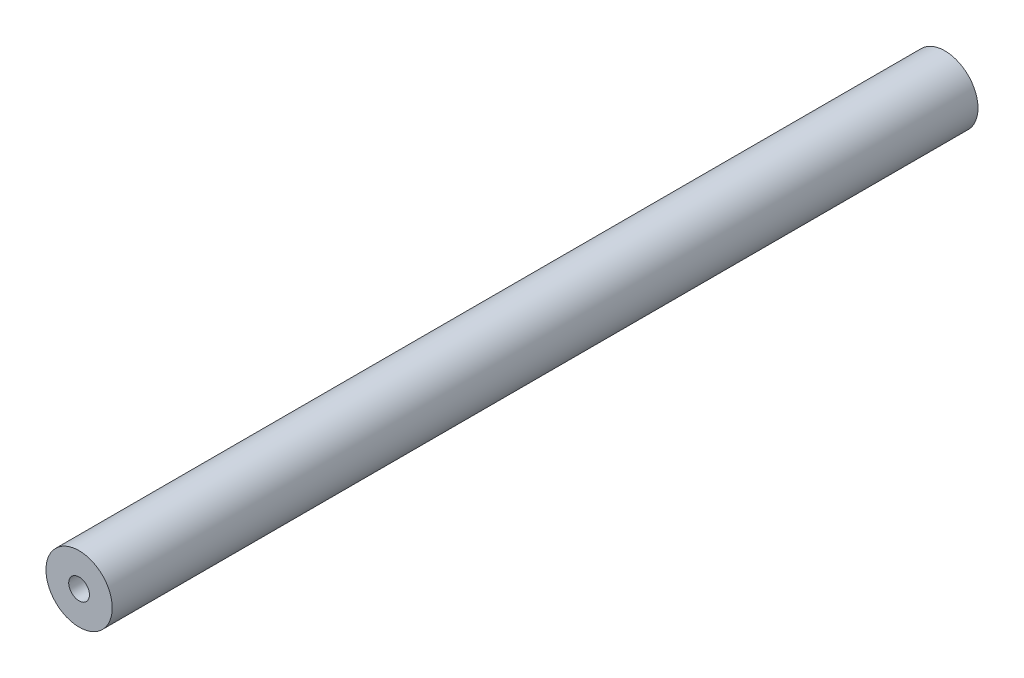
ISO-10303-21;
HEADER;
FILE_DESCRIPTION(('STEP AP214'),'2;1');
FILE_NAME('part.step','',(''),(''),'','','');
FILE_SCHEMA(('AUTOMOTIVE_DESIGN { 1 0 10303 214 1 1 1 1 }'));
ENDSEC;
DATA;
#1=APPLICATION_CONTEXT('core data for automotive mechanical design processes');
#2=APPLICATION_PROTOCOL_DEFINITION('international standard','automotive_design',2000,#1);
#3=PRODUCT_CONTEXT('',#1,'mechanical');
#4=PRODUCT('Part','Part','',(#3));
#5=PRODUCT_RELATED_PRODUCT_CATEGORY('part','',(#4));
#6=PRODUCT_DEFINITION_FORMATION('','',#4);
#7=PRODUCT_DEFINITION_CONTEXT('part definition',#1,'design');
#8=PRODUCT_DEFINITION('design','',#6,#7);
#9=PRODUCT_DEFINITION_SHAPE('','',#8);
#10=(LENGTH_UNIT() NAMED_UNIT(*) SI_UNIT(.MILLI.,.METRE.));
#11=(NAMED_UNIT(*) PLANE_ANGLE_UNIT() SI_UNIT($,.RADIAN.));
#12=(NAMED_UNIT(*) SI_UNIT($,.STERADIAN.) SOLID_ANGLE_UNIT());
#13=UNCERTAINTY_MEASURE_WITH_UNIT(LENGTH_MEASURE(1.E-05),#10,'distance_accuracy_value','');
#14=(GEOMETRIC_REPRESENTATION_CONTEXT(3) GLOBAL_UNCERTAINTY_ASSIGNED_CONTEXT((#13)) GLOBAL_UNIT_ASSIGNED_CONTEXT((#10,
#11,#12)) REPRESENTATION_CONTEXT('',''));
#15=CARTESIAN_POINT('',(0.,0.,0.));
#16=DIRECTION('',(0.,0.,1.));
#17=DIRECTION('',(1.,0.,0.));
#18=AXIS2_PLACEMENT_3D('',#15,#16,#17);
#19=CARTESIAN_POINT('',(0.,0.,9.99));
#20=DIRECTION('',(0.,0.,1.));
#21=DIRECTION('',(1.,0.,0.));
#22=AXIS2_PLACEMENT_3D('',#19,#20,#21);
#23=PLANE('',#22);
#24=CARTESIAN_POINT('',(0.,0.,9.99));
#25=DIRECTION('',(0.,0.,1.));
#26=DIRECTION('',(1.,0.,0.));
#27=AXIS2_PLACEMENT_3D('',#24,#25,#26);
#28=CIRCLE('',#27,1.25);
#29=CARTESIAN_POINT('',(1.25,0.,9.99));
#30=VERTEX_POINT('',#29);
#31=EDGE_CURVE('E9',#30,#30,#28,.T.);
#32=ORIENTED_EDGE('',*,*,#31,.F.);
#33=EDGE_LOOP('',(#32));
#34=FACE_BOUND('',#33,.T.);
#35=ADVANCED_FACE('F14',(#34),#23,.F.);
#36=CARTESIAN_POINT('',(0.,0.,94.51));
#37=DIRECTION('',(0.,0.,1.));
#38=DIRECTION('',(1.,0.,0.));
#39=AXIS2_PLACEMENT_3D('',#36,#37,#38);
#40=PLANE('',#39);
#41=CARTESIAN_POINT('',(0.,0.,94.51));
#42=DIRECTION('',(0.,0.,1.));
#43=DIRECTION('',(1.,0.,0.));
#44=AXIS2_PLACEMENT_3D('',#41,#42,#43);
#45=CIRCLE('',#44,1.25);
#46=CARTESIAN_POINT('',(1.25,0.,94.51));
#47=VERTEX_POINT('',#46);
#48=EDGE_CURVE('E112',#47,#47,#45,.T.);
#49=ORIENTED_EDGE('',*,*,#48,.T.);
#50=EDGE_LOOP('',(#49));
#51=FACE_BOUND('',#50,.T.);
#52=ADVANCED_FACE('F93',(#51),#40,.T.);
#53=CARTESIAN_POINT('',(0.,0.,-0.01));
#54=DIRECTION('',(0.,0.,1.));
#55=DIRECTION('',(1.,0.,0.));
#56=AXIS2_PLACEMENT_3D('',#53,#54,#55);
#57=CYLINDRICAL_SURFACE('',#56,1.25);
#58=CARTESIAN_POINT('',(0.,0.,0.));
#59=DIRECTION('',(0.,0.,1.));
#60=DIRECTION('',(1.,0.,0.));
#61=AXIS2_PLACEMENT_3D('',#58,#59,#60);
#62=CIRCLE('',#61,1.25);
#63=CARTESIAN_POINT('',(1.25,0.,0.));
#64=VERTEX_POINT('',#63);
#65=EDGE_CURVE('E18',#64,#64,#62,.T.);
#66=ORIENTED_EDGE('',*,*,#65,.F.);
#67=DIRECTION('',(0.,0.,1.));
#68=VECTOR('',#67,1.);
#69=CARTESIAN_POINT('',(1.25,0.,-0.01));
#70=LINE('',#69,#68);
#71=EDGE_CURVE('E25',#64,#30,#70,.T.);
#72=ORIENTED_EDGE('',*,*,#71,.T.);
#73=ORIENTED_EDGE('',*,*,#31,.T.);
#74=ORIENTED_EDGE('',*,*,#71,.F.);
#75=EDGE_LOOP('',(#66,#72,#73,#74));
#76=FACE_BOUND('',#75,.T.);
#77=ADVANCED_FACE('F99',(#76),#57,.F.);
#78=CARTESIAN_POINT('',(0.,0.,94.51));
#79=DIRECTION('',(0.,0.,1.));
#80=DIRECTION('',(1.,0.,0.));
#81=AXIS2_PLACEMENT_3D('',#78,#79,#80);
#82=CYLINDRICAL_SURFACE('',#81,1.25);
#83=DIRECTION('',(0.,0.,1.));
#84=VECTOR('',#83,1.);
#85=CARTESIAN_POINT('',(1.25,0.,94.51));
#86=LINE('',#85,#84);
#87=CARTESIAN_POINT('',(1.25,0.,104.5));
#88=VERTEX_POINT('',#87);
#89=EDGE_CURVE('E111',#47,#88,#86,.T.);
#90=ORIENTED_EDGE('',*,*,#89,.F.);
#91=ORIENTED_EDGE('',*,*,#48,.F.);
#92=ORIENTED_EDGE('',*,*,#89,.T.);
#93=CARTESIAN_POINT('',(0.,0.,104.5));
#94=DIRECTION('',(0.,0.,1.));
#95=DIRECTION('',(1.,0.,0.));
#96=AXIS2_PLACEMENT_3D('',#93,#94,#95);
#97=CIRCLE('',#96,1.25);
#98=EDGE_CURVE('E64',#88,#88,#97,.T.);
#99=ORIENTED_EDGE('',*,*,#98,.T.);
#100=EDGE_LOOP('',(#90,#91,#92,#99));
#101=FACE_BOUND('',#100,.T.);
#102=ADVANCED_FACE('F89',(#101),#82,.F.);
#103=CARTESIAN_POINT('',(0.,0.,0.));
#104=DIRECTION('',(0.,0.,1.));
#105=DIRECTION('',(1.,0.,0.));
#106=AXIS2_PLACEMENT_3D('',#103,#104,#105);
#107=PLANE('',#106);
#108=ORIENTED_EDGE('',*,*,#65,.T.);
#109=EDGE_LOOP('',(#108));
#110=FACE_BOUND('',#109,.T.);
#111=CARTESIAN_POINT('',(0.,0.,0.));
#112=DIRECTION('',(0.,0.,1.));
#113=DIRECTION('',(1.,0.,0.));
#114=AXIS2_PLACEMENT_3D('',#111,#112,#113);
#115=CIRCLE('',#114,4.);
#116=CARTESIAN_POINT('',(4.,0.,0.));
#117=VERTEX_POINT('',#116);
#118=EDGE_CURVE('E60',#117,#117,#115,.T.);
#119=ORIENTED_EDGE('',*,*,#118,.F.);
#120=EDGE_LOOP('',(#119));
#121=FACE_BOUND('',#120,.T.);
#122=ADVANCED_FACE('F81',(#110,#121),#107,.F.);
#123=CARTESIAN_POINT('',(0.,0.,104.5));
#124=DIRECTION('',(0.,0.,1.));
#125=DIRECTION('',(1.,0.,0.));
#126=AXIS2_PLACEMENT_3D('',#123,#124,#125);
#127=PLANE('',#126);
#128=ORIENTED_EDGE('',*,*,#98,.F.);
#129=EDGE_LOOP('',(#128));
#130=FACE_BOUND('',#129,.T.);
#131=CARTESIAN_POINT('',(0.,0.,104.5));
#132=DIRECTION('',(0.,0.,1.));
#133=DIRECTION('',(1.,0.,0.));
#134=AXIS2_PLACEMENT_3D('',#131,#132,#133);
#135=CIRCLE('',#134,4.);
#136=CARTESIAN_POINT('',(4.,0.,104.5));
#137=VERTEX_POINT('',#136);
#138=EDGE_CURVE('E73',#137,#137,#135,.T.);
#139=ORIENTED_EDGE('',*,*,#138,.T.);
#140=EDGE_LOOP('',(#139));
#141=FACE_BOUND('',#140,.T.);
#142=ADVANCED_FACE('F16',(#130,#141),#127,.T.);
#143=CARTESIAN_POINT('',(0.,0.,0.));
#144=DIRECTION('',(0.,0.,1.));
#145=DIRECTION('',(1.,0.,0.));
#146=AXIS2_PLACEMENT_3D('',#143,#144,#145);
#147=CYLINDRICAL_SURFACE('',#146,4.);
#148=ORIENTED_EDGE('',*,*,#138,.F.);
#149=DIRECTION('',(0.,0.,1.));
#150=VECTOR('',#149,1.);
#151=CARTESIAN_POINT('',(4.,0.,0.));
#152=LINE('',#151,#150);
#153=EDGE_CURVE('E55',#117,#137,#152,.T.);
#154=ORIENTED_EDGE('',*,*,#153,.F.);
#155=ORIENTED_EDGE('',*,*,#118,.T.);
#156=ORIENTED_EDGE('',*,*,#153,.T.);
#157=EDGE_LOOP('',(#148,#154,#155,#156));
#158=FACE_BOUND('',#157,.T.);
#159=ADVANCED_FACE('F61',(#158),#147,.T.);
#160=CLOSED_SHELL('',(#35,#52,#77,#102,#122,#142,#159));
#161=MANIFOLD_SOLID_BREP('B1',#160);
#162=ADVANCED_BREP_SHAPE_REPRESENTATION('',(#18,#161),#14);
#163=SHAPE_DEFINITION_REPRESENTATION(#9,#162);
ENDSEC;
END-ISO-10303-21;
